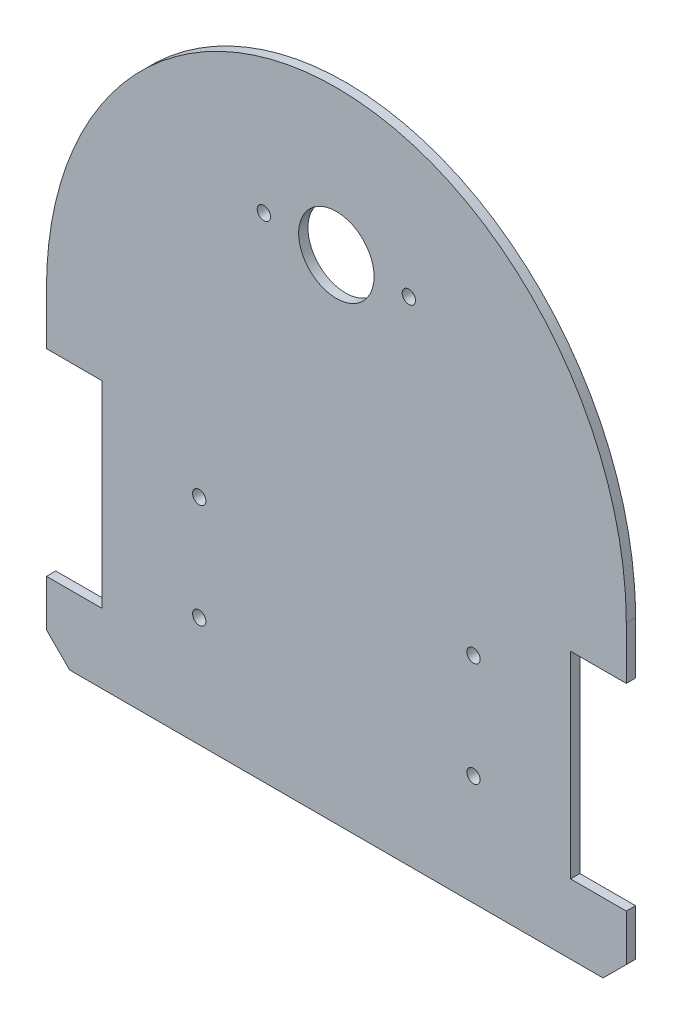
ISO-10303-21;
HEADER;
FILE_DESCRIPTION(('STEP AP214'),'2;1');
FILE_NAME('part.step','',(''),(''),'','','');
FILE_SCHEMA(('AUTOMOTIVE_DESIGN { 1 0 10303 214 1 1 1 1 }'));
ENDSEC;
DATA;
#1=APPLICATION_CONTEXT('core data for automotive mechanical design processes');
#2=APPLICATION_PROTOCOL_DEFINITION('international standard','automotive_design',2000,#1);
#3=PRODUCT_CONTEXT('',#1,'mechanical');
#4=PRODUCT('Part','Part','',(#3));
#5=PRODUCT_RELATED_PRODUCT_CATEGORY('part','',(#4));
#6=PRODUCT_DEFINITION_FORMATION('','',#4);
#7=PRODUCT_DEFINITION_CONTEXT('part definition',#1,'design');
#8=PRODUCT_DEFINITION('design','',#6,#7);
#9=PRODUCT_DEFINITION_SHAPE('','',#8);
#10=(LENGTH_UNIT() NAMED_UNIT(*) SI_UNIT(.MILLI.,.METRE.));
#11=(NAMED_UNIT(*) PLANE_ANGLE_UNIT() SI_UNIT($,.RADIAN.));
#12=(NAMED_UNIT(*) SI_UNIT($,.STERADIAN.) SOLID_ANGLE_UNIT());
#13=UNCERTAINTY_MEASURE_WITH_UNIT(LENGTH_MEASURE(1.E-05),#10,'distance_accuracy_value','');
#14=(GEOMETRIC_REPRESENTATION_CONTEXT(3) GLOBAL_UNCERTAINTY_ASSIGNED_CONTEXT((#13)) GLOBAL_UNIT_ASSIGNED_CONTEXT((#10,
#11,#12)) REPRESENTATION_CONTEXT('',''));
#15=CARTESIAN_POINT('',(0.,0.,0.));
#16=DIRECTION('',(0.,0.,1.));
#17=DIRECTION('',(1.,0.,0.));
#18=AXIS2_PLACEMENT_3D('',#15,#16,#17);
#19=CARTESIAN_POINT('',(-50.,-55.,1.6));
#20=DIRECTION('',(1.,0.,0.));
#21=DIRECTION('',(0.,0.,-1.));
#22=AXIS2_PLACEMENT_3D('',#19,#20,#21);
#23=PLANE('',#22);
#24=DIRECTION('',(0.,-1.,0.));
#25=VECTOR('',#24,1.);
#26=CARTESIAN_POINT('',(-50.,-55.,0.));
#27=LINE('',#26,#25);
#28=CARTESIAN_POINT('',(-50.,0.,0.));
#29=VERTEX_POINT('',#28);
#30=CARTESIAN_POINT('',(-50.,-9.00000000000001,0.));
#31=VERTEX_POINT('',#30);
#32=EDGE_CURVE('E270',#29,#31,#27,.T.);
#33=ORIENTED_EDGE('',*,*,#32,.T.);
#34=DIRECTION('',(0.,0.,1.));
#35=VECTOR('',#34,1.);
#36=CARTESIAN_POINT('',(-50.,-9.00000000000001,0.));
#37=LINE('',#36,#35);
#38=CARTESIAN_POINT('',(-50.,-9.00000000000001,1.6));
#39=VERTEX_POINT('',#38);
#40=EDGE_CURVE('E186',#31,#39,#37,.T.);
#41=ORIENTED_EDGE('',*,*,#40,.T.);
#42=DIRECTION('',(0.,-1.,0.));
#43=VECTOR('',#42,1.);
#44=CARTESIAN_POINT('',(-50.,-55.,1.6));
#45=LINE('',#44,#43);
#46=CARTESIAN_POINT('',(-50.,0.,1.6));
#47=VERTEX_POINT('',#46);
#48=EDGE_CURVE('E313',#47,#39,#45,.T.);
#49=ORIENTED_EDGE('',*,*,#48,.F.);
#50=DIRECTION('',(0.,0.,1.));
#51=VECTOR('',#50,1.);
#52=CARTESIAN_POINT('',(-50.,0.,0.));
#53=LINE('',#52,#51);
#54=EDGE_CURVE('E273',#29,#47,#53,.T.);
#55=ORIENTED_EDGE('',*,*,#54,.F.);
#56=EDGE_LOOP('',(#33,#41,#49,#55));
#57=FACE_BOUND('',#56,.T.);
#58=ADVANCED_FACE('F45',(#57),#23,.F.);
#59=CARTESIAN_POINT('',(50.,-55.,1.6));
#60=DIRECTION('',(-1.,0.,0.));
#61=DIRECTION('',(0.,0.,1.));
#62=AXIS2_PLACEMENT_3D('',#59,#60,#61);
#63=PLANE('',#62);
#64=DIRECTION('',(0.,1.,0.));
#65=VECTOR('',#64,1.);
#66=CARTESIAN_POINT('',(50.,-55.,1.6));
#67=LINE('',#66,#65);
#68=CARTESIAN_POINT('',(50.,-51.,1.6));
#69=VERTEX_POINT('',#68);
#70=CARTESIAN_POINT('',(50.,-43.,1.6));
#71=VERTEX_POINT('',#70);
#72=EDGE_CURVE('E281',#69,#71,#67,.T.);
#73=ORIENTED_EDGE('',*,*,#72,.F.);
#74=DIRECTION('',(0.,0.,-1.));
#75=VECTOR('',#74,1.);
#76=CARTESIAN_POINT('',(50.,-51.,1.6));
#77=LINE('',#76,#75);
#78=CARTESIAN_POINT('',(50.,-51.,0.));
#79=VERTEX_POINT('',#78);
#80=EDGE_CURVE('E289',#69,#79,#77,.T.);
#81=ORIENTED_EDGE('',*,*,#80,.T.);
#82=DIRECTION('',(0.,1.,0.));
#83=VECTOR('',#82,1.);
#84=CARTESIAN_POINT('',(50.,-55.,0.));
#85=LINE('',#84,#83);
#86=CARTESIAN_POINT('',(50.,-43.,0.));
#87=VERTEX_POINT('',#86);
#88=EDGE_CURVE('E284',#79,#87,#85,.T.);
#89=ORIENTED_EDGE('',*,*,#88,.T.);
#90=DIRECTION('',(0.,0.,1.));
#91=VECTOR('',#90,1.);
#92=CARTESIAN_POINT('',(50.,-43.,0.));
#93=LINE('',#92,#91);
#94=EDGE_CURVE('E199',#87,#71,#93,.T.);
#95=ORIENTED_EDGE('',*,*,#94,.T.);
#96=EDGE_LOOP('',(#73,#81,#89,#95));
#97=FACE_BOUND('',#96,.T.);
#98=ADVANCED_FACE('F234',(#97),#63,.F.);
#99=CARTESIAN_POINT('',(0.,0.,1.6));
#100=DIRECTION('',(0.,0.,1.));
#101=DIRECTION('',(1.,0.,0.));
#102=AXIS2_PLACEMENT_3D('',#99,#100,#101);
#103=PLANE('',#102);
#104=CARTESIAN_POINT('',(-12.5,30.,1.6));
#105=DIRECTION('',(0.,0.,1.));
#106=DIRECTION('',(1.,0.,0.));
#107=AXIS2_PLACEMENT_3D('',#104,#105,#106);
#108=CIRCLE('',#107,1.15);
#109=CARTESIAN_POINT('',(-11.35,30.,1.6));
#110=VERTEX_POINT('',#109);
#111=EDGE_CURVE('E568',#110,#110,#108,.T.);
#112=ORIENTED_EDGE('',*,*,#111,.F.);
#113=EDGE_LOOP('',(#112));
#114=FACE_BOUND('',#113,.T.);
#115=CARTESIAN_POINT('',(12.5,30.,1.6));
#116=DIRECTION('',(0.,0.,1.));
#117=DIRECTION('',(1.,0.,0.));
#118=AXIS2_PLACEMENT_3D('',#115,#116,#117);
#119=CIRCLE('',#118,1.15);
#120=CARTESIAN_POINT('',(13.65,30.,1.6));
#121=VERTEX_POINT('',#120);
#122=EDGE_CURVE('E569',#121,#121,#119,.T.);
#123=ORIENTED_EDGE('',*,*,#122,.F.);
#124=EDGE_LOOP('',(#123));
#125=FACE_BOUND('',#124,.T.);
#126=CARTESIAN_POINT('',(23.6499875636657,-18.,1.6));
#127=DIRECTION('',(0.,0.,1.));
#128=DIRECTION('',(-1.,0.,0.));
#129=AXIS2_PLACEMENT_3D('',#126,#127,#128);
#130=CIRCLE('',#129,1.15);
#131=CARTESIAN_POINT('',(22.4999875636657,-18.,1.6));
#132=VERTEX_POINT('',#131);
#133=EDGE_CURVE('E592',#132,#132,#130,.T.);
#134=ORIENTED_EDGE('',*,*,#133,.F.);
#135=EDGE_LOOP('',(#134));
#136=FACE_BOUND('',#135,.T.);
#137=CARTESIAN_POINT('',(23.6499875636657,-36.,1.6));
#138=DIRECTION('',(0.,0.,1.));
#139=DIRECTION('',(-1.,0.,0.));
#140=AXIS2_PLACEMENT_3D('',#137,#138,#139);
#141=CIRCLE('',#140,1.15);
#142=CARTESIAN_POINT('',(22.4999875636657,-36.,1.6));
#143=VERTEX_POINT('',#142);
#144=EDGE_CURVE('E586',#143,#143,#141,.T.);
#145=ORIENTED_EDGE('',*,*,#144,.F.);
#146=EDGE_LOOP('',(#145));
#147=FACE_BOUND('',#146,.T.);
#148=CARTESIAN_POINT('',(-23.6499875636657,-36.,1.6));
#149=DIRECTION('',(0.,0.,1.));
#150=DIRECTION('',(1.,0.,0.));
#151=AXIS2_PLACEMENT_3D('',#148,#149,#150);
#152=CIRCLE('',#151,1.15);
#153=CARTESIAN_POINT('',(-22.4999875636657,-36.,1.6));
#154=VERTEX_POINT('',#153);
#155=EDGE_CURVE('E579',#154,#154,#152,.T.);
#156=ORIENTED_EDGE('',*,*,#155,.F.);
#157=EDGE_LOOP('',(#156));
#158=FACE_BOUND('',#157,.T.);
#159=CARTESIAN_POINT('',(-23.6499875636657,-18.,1.6));
#160=DIRECTION('',(0.,0.,1.));
#161=DIRECTION('',(1.,0.,0.));
#162=AXIS2_PLACEMENT_3D('',#159,#160,#161);
#163=CIRCLE('',#162,1.15);
#164=CARTESIAN_POINT('',(-22.4999875636657,-18.,1.6));
#165=VERTEX_POINT('',#164);
#166=EDGE_CURVE('E582',#165,#165,#163,.T.);
#167=ORIENTED_EDGE('',*,*,#166,.F.);
#168=EDGE_LOOP('',(#167));
#169=FACE_BOUND('',#168,.T.);
#170=CARTESIAN_POINT('',(0.,30.,1.6));
#171=DIRECTION('',(0.,0.,1.));
#172=DIRECTION('',(1.,0.,0.));
#173=AXIS2_PLACEMENT_3D('',#170,#171,#172);
#174=CIRCLE('',#173,6.5);
#175=CARTESIAN_POINT('',(6.5,30.,1.6));
#176=VERTEX_POINT('',#175);
#177=EDGE_CURVE('E179',#176,#176,#174,.T.);
#178=ORIENTED_EDGE('',*,*,#177,.F.);
#179=EDGE_LOOP('',(#178));
#180=FACE_BOUND('',#179,.T.);
#181=DIRECTION('',(1.,0.,0.));
#182=VECTOR('',#181,1.);
#183=CARTESIAN_POINT('',(50.,-55.,1.6));
#184=LINE('',#183,#182);
#185=CARTESIAN_POINT('',(-46.,-55.,1.6));
#186=VERTEX_POINT('',#185);
#187=CARTESIAN_POINT('',(46.,-55.,1.6));
#188=VERTEX_POINT('',#187);
#189=EDGE_CURVE('E304',#186,#188,#184,.T.);
#190=ORIENTED_EDGE('',*,*,#189,.T.);
#191=DIRECTION('',(-0.707106781186549,-0.707106781186546,0.));
#192=VECTOR('',#191,1.);
#193=CARTESIAN_POINT('',(50.4999999999999,-50.5000000000001,1.6));
#194=LINE('',#193,#192);
#195=EDGE_CURVE('E54',#188,#69,#194,.F.);
#196=ORIENTED_EDGE('',*,*,#195,.T.);
#197=ORIENTED_EDGE('',*,*,#72,.T.);
#198=DIRECTION('',(1.,0.,0.));
#199=VECTOR('',#198,1.);
#200=CARTESIAN_POINT('',(50.,-43.,1.6));
#201=LINE('',#200,#199);
#202=CARTESIAN_POINT('',(40.4,-43.,1.6));
#203=VERTEX_POINT('',#202);
#204=EDGE_CURVE('E203',#203,#71,#201,.T.);
#205=ORIENTED_EDGE('',*,*,#204,.F.);
#206=DIRECTION('',(0.,-1.,0.));
#207=VECTOR('',#206,1.);
#208=CARTESIAN_POINT('',(40.4,-9.00000000000001,1.6));
#209=LINE('',#208,#207);
#210=CARTESIAN_POINT('',(40.4,-9.00000000000001,1.6));
#211=VERTEX_POINT('',#210);
#212=EDGE_CURVE('E206',#211,#203,#209,.T.);
#213=ORIENTED_EDGE('',*,*,#212,.F.);
#214=DIRECTION('',(-1.,0.,0.));
#215=VECTOR('',#214,1.);
#216=CARTESIAN_POINT('',(50.,-9.00000000000001,1.6));
#217=LINE('',#216,#215);
#218=CARTESIAN_POINT('',(50.,-9.00000000000001,1.6));
#219=VERTEX_POINT('',#218);
#220=EDGE_CURVE('E184',#219,#211,#217,.T.);
#221=ORIENTED_EDGE('',*,*,#220,.F.);
#222=CARTESIAN_POINT('',(50.,0.,1.6));
#223=VERTEX_POINT('',#222);
#224=EDGE_CURVE('E307',#219,#223,#67,.T.);
#225=ORIENTED_EDGE('',*,*,#224,.T.);
#226=CARTESIAN_POINT('',(0.,0.,1.6));
#227=DIRECTION('',(0.,0.,-1.));
#228=DIRECTION('',(0.,-1.,0.));
#229=AXIS2_PLACEMENT_3D('',#226,#227,#228);
#230=ELLIPSE('',#229,55.,50.);
#231=EDGE_CURVE('E189',#47,#223,#230,.T.);
#232=ORIENTED_EDGE('',*,*,#231,.F.);
#233=ORIENTED_EDGE('',*,*,#48,.T.);
#234=DIRECTION('',(-1.,0.,0.));
#235=VECTOR('',#234,1.);
#236=CARTESIAN_POINT('',(-50.,-9.00000000000001,1.6));
#237=LINE('',#236,#235);
#238=CARTESIAN_POINT('',(-40.4,-9.00000000000001,1.6));
#239=VERTEX_POINT('',#238);
#240=EDGE_CURVE('E174',#239,#39,#237,.T.);
#241=ORIENTED_EDGE('',*,*,#240,.F.);
#242=DIRECTION('',(0.,1.,0.));
#243=VECTOR('',#242,1.);
#244=CARTESIAN_POINT('',(-40.4,-9.00000000000001,1.6));
#245=LINE('',#244,#243);
#246=CARTESIAN_POINT('',(-40.4,-43.,1.6));
#247=VERTEX_POINT('',#246);
#248=EDGE_CURVE('E176',#247,#239,#245,.T.);
#249=ORIENTED_EDGE('',*,*,#248,.F.);
#250=DIRECTION('',(1.,0.,0.));
#251=VECTOR('',#250,1.);
#252=CARTESIAN_POINT('',(-50.,-43.,1.6));
#253=LINE('',#252,#251);
#254=CARTESIAN_POINT('',(-50.,-43.,1.6));
#255=VERTEX_POINT('',#254);
#256=EDGE_CURVE('E155',#255,#247,#253,.T.);
#257=ORIENTED_EDGE('',*,*,#256,.F.);
#258=CARTESIAN_POINT('',(-50.,-51.,1.6));
#259=VERTEX_POINT('',#258);
#260=EDGE_CURVE('E286',#255,#259,#45,.T.);
#261=ORIENTED_EDGE('',*,*,#260,.T.);
#262=DIRECTION('',(-0.707106781186546,0.707106781186549,0.));
#263=VECTOR('',#262,1.);
#264=CARTESIAN_POINT('',(-50.5000000000001,-50.4999999999999,1.6));
#265=LINE('',#264,#263);
#266=EDGE_CURVE('E300',#259,#186,#265,.F.);
#267=ORIENTED_EDGE('',*,*,#266,.T.);
#268=EDGE_LOOP('',(#190,#196,#197,#205,#213,#221,#225,#232,#233,#241,#249,#257,#261,#267));
#269=FACE_BOUND('',#268,.T.);
#270=ADVANCED_FACE('F231',(#114,#125,#136,#147,#158,#169,#180,#269),#103,.T.);
#271=CARTESIAN_POINT('',(0.,0.,0.));
#272=DIRECTION('',(0.,0.,1.));
#273=DIRECTION('',(1.,0.,0.));
#274=AXIS2_PLACEMENT_3D('',#271,#272,#273);
#275=PLANE('',#274);
#276=CARTESIAN_POINT('',(-12.5,30.,0.));
#277=DIRECTION('',(0.,0.,1.));
#278=DIRECTION('',(1.,0.,0.));
#279=AXIS2_PLACEMENT_3D('',#276,#277,#278);
#280=CIRCLE('',#279,1.15);
#281=CARTESIAN_POINT('',(-11.35,30.,0.));
#282=VERTEX_POINT('',#281);
#283=EDGE_CURVE('E565',#282,#282,#280,.T.);
#284=ORIENTED_EDGE('',*,*,#283,.T.);
#285=EDGE_LOOP('',(#284));
#286=FACE_BOUND('',#285,.T.);
#287=CARTESIAN_POINT('',(12.5,30.,0.));
#288=DIRECTION('',(0.,0.,1.));
#289=DIRECTION('',(1.,0.,0.));
#290=AXIS2_PLACEMENT_3D('',#287,#288,#289);
#291=CIRCLE('',#290,1.15);
#292=CARTESIAN_POINT('',(13.65,30.,0.));
#293=VERTEX_POINT('',#292);
#294=EDGE_CURVE('E574',#293,#293,#291,.T.);
#295=ORIENTED_EDGE('',*,*,#294,.T.);
#296=EDGE_LOOP('',(#295));
#297=FACE_BOUND('',#296,.T.);
#298=CARTESIAN_POINT('',(23.6499875636657,-18.,0.));
#299=DIRECTION('',(0.,0.,1.));
#300=DIRECTION('',(-1.,0.,0.));
#301=AXIS2_PLACEMENT_3D('',#298,#299,#300);
#302=CIRCLE('',#301,1.15);
#303=CARTESIAN_POINT('',(22.4999875636657,-18.,0.));
#304=VERTEX_POINT('',#303);
#305=EDGE_CURVE('E571',#304,#304,#302,.T.);
#306=ORIENTED_EDGE('',*,*,#305,.T.);
#307=EDGE_LOOP('',(#306));
#308=FACE_BOUND('',#307,.T.);
#309=CARTESIAN_POINT('',(23.6499875636657,-36.,0.));
#310=DIRECTION('',(0.,0.,1.));
#311=DIRECTION('',(-1.,0.,0.));
#312=AXIS2_PLACEMENT_3D('',#309,#310,#311);
#313=CIRCLE('',#312,1.15);
#314=CARTESIAN_POINT('',(22.4999875636657,-36.,0.));
#315=VERTEX_POINT('',#314);
#316=EDGE_CURVE('E589',#315,#315,#313,.T.);
#317=ORIENTED_EDGE('',*,*,#316,.T.);
#318=EDGE_LOOP('',(#317));
#319=FACE_BOUND('',#318,.T.);
#320=CARTESIAN_POINT('',(-23.6499875636657,-36.,0.));
#321=DIRECTION('',(0.,0.,1.));
#322=DIRECTION('',(1.,0.,0.));
#323=AXIS2_PLACEMENT_3D('',#320,#321,#322);
#324=CIRCLE('',#323,1.15);
#325=CARTESIAN_POINT('',(-22.4999875636657,-36.,0.));
#326=VERTEX_POINT('',#325);
#327=EDGE_CURVE('E583',#326,#326,#324,.T.);
#328=ORIENTED_EDGE('',*,*,#327,.T.);
#329=EDGE_LOOP('',(#328));
#330=FACE_BOUND('',#329,.T.);
#331=CARTESIAN_POINT('',(-23.6499875636657,-18.,0.));
#332=DIRECTION('',(0.,0.,1.));
#333=DIRECTION('',(1.,0.,0.));
#334=AXIS2_PLACEMENT_3D('',#331,#332,#333);
#335=CIRCLE('',#334,1.15);
#336=CARTESIAN_POINT('',(-22.4999875636657,-18.,0.));
#337=VERTEX_POINT('',#336);
#338=EDGE_CURVE('E597',#337,#337,#335,.T.);
#339=ORIENTED_EDGE('',*,*,#338,.T.);
#340=EDGE_LOOP('',(#339));
#341=FACE_BOUND('',#340,.T.);
#342=CARTESIAN_POINT('',(0.,30.,0.));
#343=DIRECTION('',(0.,0.,1.));
#344=DIRECTION('',(1.,0.,0.));
#345=AXIS2_PLACEMENT_3D('',#342,#343,#344);
#346=CIRCLE('',#345,6.5);
#347=CARTESIAN_POINT('',(6.5,30.,0.));
#348=VERTEX_POINT('',#347);
#349=EDGE_CURVE('E202',#348,#348,#346,.T.);
#350=ORIENTED_EDGE('',*,*,#349,.T.);
#351=EDGE_LOOP('',(#350));
#352=FACE_BOUND('',#351,.T.);
#353=ORIENTED_EDGE('',*,*,#88,.F.);
#354=DIRECTION('',(0.707106781186549,0.707106781186546,0.));
#355=VECTOR('',#354,1.);
#356=CARTESIAN_POINT('',(50.,-51.,0.));
#357=LINE('',#356,#355);
#358=CARTESIAN_POINT('',(46.,-55.,0.));
#359=VERTEX_POINT('',#358);
#360=EDGE_CURVE('E294',#79,#359,#357,.F.);
#361=ORIENTED_EDGE('',*,*,#360,.T.);
#362=DIRECTION('',(1.,0.,0.));
#363=VECTOR('',#362,1.);
#364=CARTESIAN_POINT('',(50.,-55.,0.));
#365=LINE('',#364,#363);
#366=CARTESIAN_POINT('',(-46.,-55.,0.));
#367=VERTEX_POINT('',#366);
#368=EDGE_CURVE('E275',#367,#359,#365,.T.);
#369=ORIENTED_EDGE('',*,*,#368,.F.);
#370=DIRECTION('',(0.707106781186546,-0.707106781186549,0.));
#371=VECTOR('',#370,1.);
#372=CARTESIAN_POINT('',(-46.,-55.,0.));
#373=LINE('',#372,#371);
#374=CARTESIAN_POINT('',(-50.,-51.,0.));
#375=VERTEX_POINT('',#374);
#376=EDGE_CURVE('E292',#367,#375,#373,.F.);
#377=ORIENTED_EDGE('',*,*,#376,.T.);
#378=CARTESIAN_POINT('',(-50.,-43.,0.));
#379=VERTEX_POINT('',#378);
#380=EDGE_CURVE('E173',#379,#375,#27,.T.);
#381=ORIENTED_EDGE('',*,*,#380,.F.);
#382=DIRECTION('',(1.,0.,0.));
#383=VECTOR('',#382,1.);
#384=CARTESIAN_POINT('',(-50.,-43.,0.));
#385=LINE('',#384,#383);
#386=CARTESIAN_POINT('',(-40.4,-43.,0.));
#387=VERTEX_POINT('',#386);
#388=EDGE_CURVE('E152',#379,#387,#385,.T.);
#389=ORIENTED_EDGE('',*,*,#388,.T.);
#390=DIRECTION('',(0.,1.,0.));
#391=VECTOR('',#390,1.);
#392=CARTESIAN_POINT('',(-40.4,-9.00000000000001,0.));
#393=LINE('',#392,#391);
#394=CARTESIAN_POINT('',(-40.4,-9.00000000000001,0.));
#395=VERTEX_POINT('',#394);
#396=EDGE_CURVE('E163',#387,#395,#393,.T.);
#397=ORIENTED_EDGE('',*,*,#396,.T.);
#398=DIRECTION('',(-1.,0.,0.));
#399=VECTOR('',#398,1.);
#400=CARTESIAN_POINT('',(-50.,-9.00000000000001,0.));
#401=LINE('',#400,#399);
#402=EDGE_CURVE('E168',#395,#31,#401,.T.);
#403=ORIENTED_EDGE('',*,*,#402,.T.);
#404=ORIENTED_EDGE('',*,*,#32,.F.);
#405=CARTESIAN_POINT('',(0.,0.,0.));
#406=DIRECTION('',(0.,0.,-1.));
#407=DIRECTION('',(0.,-1.,0.));
#408=AXIS2_PLACEMENT_3D('',#405,#406,#407);
#409=ELLIPSE('',#408,55.,50.);
#410=CARTESIAN_POINT('',(50.,0.,0.));
#411=VERTEX_POINT('',#410);
#412=EDGE_CURVE('E287',#29,#411,#409,.T.);
#413=ORIENTED_EDGE('',*,*,#412,.T.);
#414=CARTESIAN_POINT('',(50.,-9.00000000000001,0.));
#415=VERTEX_POINT('',#414);
#416=EDGE_CURVE('E277',#415,#411,#85,.T.);
#417=ORIENTED_EDGE('',*,*,#416,.F.);
#418=DIRECTION('',(-1.,0.,0.));
#419=VECTOR('',#418,1.);
#420=CARTESIAN_POINT('',(50.,-9.00000000000001,0.));
#421=LINE('',#420,#419);
#422=CARTESIAN_POINT('',(40.4,-9.00000000000001,0.));
#423=VERTEX_POINT('',#422);
#424=EDGE_CURVE('E207',#415,#423,#421,.T.);
#425=ORIENTED_EDGE('',*,*,#424,.T.);
#426=DIRECTION('',(0.,-1.,0.));
#427=VECTOR('',#426,1.);
#428=CARTESIAN_POINT('',(40.4,-9.00000000000001,0.));
#429=LINE('',#428,#427);
#430=CARTESIAN_POINT('',(40.4,-43.,0.));
#431=VERTEX_POINT('',#430);
#432=EDGE_CURVE('E214',#423,#431,#429,.T.);
#433=ORIENTED_EDGE('',*,*,#432,.T.);
#434=DIRECTION('',(1.,0.,0.));
#435=VECTOR('',#434,1.);
#436=CARTESIAN_POINT('',(50.,-43.,0.));
#437=LINE('',#436,#435);
#438=EDGE_CURVE('E194',#431,#87,#437,.T.);
#439=ORIENTED_EDGE('',*,*,#438,.T.);
#440=EDGE_LOOP('',(#353,#361,#369,#377,#381,#389,#397,#403,#404,#413,#417,#425,#433,#439));
#441=FACE_BOUND('',#440,.T.);
#442=ADVANCED_FACE('F172',(#286,#297,#308,#319,#330,#341,#352,#441),#275,.F.);
#443=ORIENTED_EDGE('',*,*,#380,.T.);
#444=DIRECTION('',(0.,0.,1.));
#445=VECTOR('',#444,1.);
#446=CARTESIAN_POINT('',(-50.,-51.,1.6));
#447=LINE('',#446,#445);
#448=EDGE_CURVE('E11',#375,#259,#447,.T.);
#449=ORIENTED_EDGE('',*,*,#448,.T.);
#450=ORIENTED_EDGE('',*,*,#260,.F.);
#451=DIRECTION('',(0.,0.,1.));
#452=VECTOR('',#451,1.);
#453=CARTESIAN_POINT('',(-50.,-43.,0.));
#454=LINE('',#453,#452);
#455=EDGE_CURVE('E160',#379,#255,#454,.T.);
#456=ORIENTED_EDGE('',*,*,#455,.F.);
#457=EDGE_LOOP('',(#443,#449,#450,#456));
#458=FACE_BOUND('',#457,.T.);
#459=ADVANCED_FACE('F238',(#458),#23,.F.);
#460=CARTESIAN_POINT('',(50.,-55.,1.6));
#461=DIRECTION('',(0.,1.,0.));
#462=DIRECTION('',(-1.,0.,0.));
#463=AXIS2_PLACEMENT_3D('',#460,#461,#462);
#464=PLANE('',#463);
#465=ORIENTED_EDGE('',*,*,#368,.T.);
#466=DIRECTION('',(0.,0.,1.));
#467=VECTOR('',#466,1.);
#468=CARTESIAN_POINT('',(46.,-55.,1.6));
#469=LINE('',#468,#467);
#470=EDGE_CURVE('E67',#359,#188,#469,.T.);
#471=ORIENTED_EDGE('',*,*,#470,.T.);
#472=ORIENTED_EDGE('',*,*,#189,.F.);
#473=DIRECTION('',(0.,0.,-1.));
#474=VECTOR('',#473,1.);
#475=CARTESIAN_POINT('',(-46.,-55.,1.6));
#476=LINE('',#475,#474);
#477=EDGE_CURVE('E296',#186,#367,#476,.T.);
#478=ORIENTED_EDGE('',*,*,#477,.T.);
#479=EDGE_LOOP('',(#465,#471,#472,#478));
#480=FACE_BOUND('',#479,.T.);
#481=ADVANCED_FACE('F242',(#480),#464,.F.);
#482=ORIENTED_EDGE('',*,*,#224,.F.);
#483=DIRECTION('',(0.,0.,1.));
#484=VECTOR('',#483,1.);
#485=CARTESIAN_POINT('',(50.,-9.00000000000001,0.));
#486=LINE('',#485,#484);
#487=EDGE_CURVE('E192',#415,#219,#486,.T.);
#488=ORIENTED_EDGE('',*,*,#487,.F.);
#489=ORIENTED_EDGE('',*,*,#416,.T.);
#490=DIRECTION('',(0.,0.,1.));
#491=VECTOR('',#490,1.);
#492=CARTESIAN_POINT('',(50.,0.,0.));
#493=LINE('',#492,#491);
#494=EDGE_CURVE('E279',#411,#223,#493,.T.);
#495=ORIENTED_EDGE('',*,*,#494,.T.);
#496=EDGE_LOOP('',(#482,#488,#489,#495));
#497=FACE_BOUND('',#496,.T.);
#498=ADVANCED_FACE('F228',(#497),#63,.F.);
#499=CARTESIAN_POINT('',(0.,0.,0.));
#500=DIRECTION('',(0.,0.,-1.));
#501=DIRECTION('',(0.,-1.,0.));
#502=AXIS2_PLACEMENT_3D('',#499,#500,#501);
#503=ELLIPSE('',#502,55.,50.);
#504=DIRECTION('',(0.,0.,1.));
#505=VECTOR('',#504,1.);
#506=SURFACE_OF_LINEAR_EXTRUSION('',#503,#505);
#507=ORIENTED_EDGE('',*,*,#412,.F.);
#508=ORIENTED_EDGE('',*,*,#54,.T.);
#509=ORIENTED_EDGE('',*,*,#231,.T.);
#510=ORIENTED_EDGE('',*,*,#494,.F.);
#511=EDGE_LOOP('',(#507,#508,#509,#510));
#512=FACE_BOUND('',#511,.T.);
#513=ADVANCED_FACE('F223',(#512),#506,.F.);
#514=CARTESIAN_POINT('',(50.,-43.,0.));
#515=DIRECTION('',(0.,-1.,0.));
#516=DIRECTION('',(1.,0.,0.));
#517=AXIS2_PLACEMENT_3D('',#514,#515,#516);
#518=PLANE('',#517);
#519=ORIENTED_EDGE('',*,*,#204,.T.);
#520=ORIENTED_EDGE('',*,*,#94,.F.);
#521=ORIENTED_EDGE('',*,*,#438,.F.);
#522=DIRECTION('',(0.,0.,1.));
#523=VECTOR('',#522,1.);
#524=CARTESIAN_POINT('',(40.4,-43.,0.));
#525=LINE('',#524,#523);
#526=EDGE_CURVE('E197',#431,#203,#525,.T.);
#527=ORIENTED_EDGE('',*,*,#526,.T.);
#528=EDGE_LOOP('',(#519,#520,#521,#527));
#529=FACE_BOUND('',#528,.T.);
#530=ADVANCED_FACE('F227',(#529),#518,.F.);
#531=CARTESIAN_POINT('',(40.4,-9.00000000000001,0.));
#532=DIRECTION('',(-1.,0.,0.));
#533=DIRECTION('',(0.,-1.,0.));
#534=AXIS2_PLACEMENT_3D('',#531,#532,#533);
#535=PLANE('',#534);
#536=ORIENTED_EDGE('',*,*,#212,.T.);
#537=ORIENTED_EDGE('',*,*,#526,.F.);
#538=ORIENTED_EDGE('',*,*,#432,.F.);
#539=DIRECTION('',(0.,0.,1.));
#540=VECTOR('',#539,1.);
#541=CARTESIAN_POINT('',(40.4,-9.00000000000001,0.));
#542=LINE('',#541,#540);
#543=EDGE_CURVE('E195',#423,#211,#542,.T.);
#544=ORIENTED_EDGE('',*,*,#543,.T.);
#545=EDGE_LOOP('',(#536,#537,#538,#544));
#546=FACE_BOUND('',#545,.T.);
#547=ADVANCED_FACE('F324',(#546),#535,.F.);
#548=CARTESIAN_POINT('',(50.,-9.00000000000001,0.));
#549=DIRECTION('',(0.,1.,0.));
#550=DIRECTION('',(0.,0.,1.));
#551=AXIS2_PLACEMENT_3D('',#548,#549,#550);
#552=PLANE('',#551);
#553=ORIENTED_EDGE('',*,*,#220,.T.);
#554=ORIENTED_EDGE('',*,*,#543,.F.);
#555=ORIENTED_EDGE('',*,*,#424,.F.);
#556=ORIENTED_EDGE('',*,*,#487,.T.);
#557=EDGE_LOOP('',(#553,#554,#555,#556));
#558=FACE_BOUND('',#557,.T.);
#559=ADVANCED_FACE('F317',(#558),#552,.F.);
#560=CARTESIAN_POINT('',(-50.,-9.00000000000001,0.));
#561=DIRECTION('',(0.,1.,0.));
#562=DIRECTION('',(0.,0.,1.));
#563=AXIS2_PLACEMENT_3D('',#560,#561,#562);
#564=PLANE('',#563);
#565=ORIENTED_EDGE('',*,*,#240,.T.);
#566=ORIENTED_EDGE('',*,*,#40,.F.);
#567=ORIENTED_EDGE('',*,*,#402,.F.);
#568=DIRECTION('',(0.,0.,1.));
#569=VECTOR('',#568,1.);
#570=CARTESIAN_POINT('',(-40.4,-9.00000000000001,0.));
#571=LINE('',#570,#569);
#572=EDGE_CURVE('E159',#395,#239,#571,.T.);
#573=ORIENTED_EDGE('',*,*,#572,.T.);
#574=EDGE_LOOP('',(#565,#566,#567,#573));
#575=FACE_BOUND('',#574,.T.);
#576=ADVANCED_FACE('F315',(#575),#564,.F.);
#577=CARTESIAN_POINT('',(-40.4,-9.00000000000001,0.));
#578=DIRECTION('',(1.,0.,0.));
#579=DIRECTION('',(0.,1.,0.));
#580=AXIS2_PLACEMENT_3D('',#577,#578,#579);
#581=PLANE('',#580);
#582=ORIENTED_EDGE('',*,*,#248,.T.);
#583=ORIENTED_EDGE('',*,*,#572,.F.);
#584=ORIENTED_EDGE('',*,*,#396,.F.);
#585=DIRECTION('',(0.,0.,1.));
#586=VECTOR('',#585,1.);
#587=CARTESIAN_POINT('',(-40.4,-43.,0.));
#588=LINE('',#587,#586);
#589=EDGE_CURVE('E148',#387,#247,#588,.T.);
#590=ORIENTED_EDGE('',*,*,#589,.T.);
#591=EDGE_LOOP('',(#582,#583,#584,#590));
#592=FACE_BOUND('',#591,.T.);
#593=ADVANCED_FACE('F164',(#592),#581,.F.);
#594=CARTESIAN_POINT('',(-50.,-43.,0.));
#595=DIRECTION('',(0.,-1.,0.));
#596=DIRECTION('',(1.,0.,0.));
#597=AXIS2_PLACEMENT_3D('',#594,#595,#596);
#598=PLANE('',#597);
#599=ORIENTED_EDGE('',*,*,#256,.T.);
#600=ORIENTED_EDGE('',*,*,#589,.F.);
#601=ORIENTED_EDGE('',*,*,#388,.F.);
#602=ORIENTED_EDGE('',*,*,#455,.T.);
#603=EDGE_LOOP('',(#599,#600,#601,#602));
#604=FACE_BOUND('',#603,.T.);
#605=ADVANCED_FACE('F150',(#604),#598,.F.);
#606=CARTESIAN_POINT('',(50.,-51.,1.6));
#607=DIRECTION('',(-0.707106781186546,0.707106781186549,0.));
#608=DIRECTION('',(0.,0.,-1.));
#609=AXIS2_PLACEMENT_3D('',#606,#607,#608);
#610=PLANE('',#609);
#611=ORIENTED_EDGE('',*,*,#195,.F.);
#612=ORIENTED_EDGE('',*,*,#470,.F.);
#613=ORIENTED_EDGE('',*,*,#360,.F.);
#614=ORIENTED_EDGE('',*,*,#80,.F.);
#615=EDGE_LOOP('',(#611,#612,#613,#614));
#616=FACE_BOUND('',#615,.T.);
#617=ADVANCED_FACE('F248',(#616),#610,.F.);
#618=CARTESIAN_POINT('',(-46.,-55.,1.6));
#619=DIRECTION('',(0.707106781186549,0.707106781186546,0.));
#620=DIRECTION('',(0.,0.,-1.));
#621=AXIS2_PLACEMENT_3D('',#618,#619,#620);
#622=PLANE('',#621);
#623=ORIENTED_EDGE('',*,*,#266,.F.);
#624=ORIENTED_EDGE('',*,*,#448,.F.);
#625=ORIENTED_EDGE('',*,*,#376,.F.);
#626=ORIENTED_EDGE('',*,*,#477,.F.);
#627=EDGE_LOOP('',(#623,#624,#625,#626));
#628=FACE_BOUND('',#627,.T.);
#629=ADVANCED_FACE('F48',(#628),#622,.F.);
#630=CARTESIAN_POINT('',(0.,30.,0.));
#631=DIRECTION('',(0.,0.,1.));
#632=DIRECTION('',(1.,0.,0.));
#633=AXIS2_PLACEMENT_3D('',#630,#631,#632);
#634=CYLINDRICAL_SURFACE('',#633,6.5);
#635=ORIENTED_EDGE('',*,*,#349,.F.);
#636=EDGE_LOOP('',(#635));
#637=FACE_BOUND('',#636,.T.);
#638=ORIENTED_EDGE('',*,*,#177,.T.);
#639=EDGE_LOOP('',(#638));
#640=FACE_BOUND('',#639,.T.);
#641=ADVANCED_FACE('F257',(#637,#640),#634,.F.);
#642=CARTESIAN_POINT('',(-23.6499875636657,-18.,0.));
#643=DIRECTION('',(0.,0.,1.));
#644=DIRECTION('',(1.,0.,0.));
#645=AXIS2_PLACEMENT_3D('',#642,#643,#644);
#646=CYLINDRICAL_SURFACE('',#645,1.15);
#647=ORIENTED_EDGE('',*,*,#338,.F.);
#648=EDGE_LOOP('',(#647));
#649=FACE_BOUND('',#648,.T.);
#650=ORIENTED_EDGE('',*,*,#166,.T.);
#651=EDGE_LOOP('',(#650));
#652=FACE_BOUND('',#651,.T.);
#653=ADVANCED_FACE('F460',(#649,#652),#646,.F.);
#654=CARTESIAN_POINT('',(-23.6499875636657,-36.,0.));
#655=DIRECTION('',(0.,0.,1.));
#656=DIRECTION('',(1.,0.,0.));
#657=AXIS2_PLACEMENT_3D('',#654,#655,#656);
#658=CYLINDRICAL_SURFACE('',#657,1.15);
#659=ORIENTED_EDGE('',*,*,#327,.F.);
#660=EDGE_LOOP('',(#659));
#661=FACE_BOUND('',#660,.T.);
#662=ORIENTED_EDGE('',*,*,#155,.T.);
#663=EDGE_LOOP('',(#662));
#664=FACE_BOUND('',#663,.T.);
#665=ADVANCED_FACE('F469',(#661,#664),#658,.F.);
#666=CARTESIAN_POINT('',(23.6499875636657,-36.,0.));
#667=DIRECTION('',(0.,0.,1.));
#668=DIRECTION('',(1.,0.,0.));
#669=AXIS2_PLACEMENT_3D('',#666,#667,#668);
#670=CYLINDRICAL_SURFACE('',#669,1.15);
#671=ORIENTED_EDGE('',*,*,#316,.F.);
#672=EDGE_LOOP('',(#671));
#673=FACE_BOUND('',#672,.T.);
#674=ORIENTED_EDGE('',*,*,#144,.T.);
#675=EDGE_LOOP('',(#674));
#676=FACE_BOUND('',#675,.T.);
#677=ADVANCED_FACE('F478',(#673,#676),#670,.F.);
#678=CARTESIAN_POINT('',(23.6499875636657,-18.,0.));
#679=DIRECTION('',(0.,0.,1.));
#680=DIRECTION('',(1.,0.,0.));
#681=AXIS2_PLACEMENT_3D('',#678,#679,#680);
#682=CYLINDRICAL_SURFACE('',#681,1.15);
#683=ORIENTED_EDGE('',*,*,#305,.F.);
#684=EDGE_LOOP('',(#683));
#685=FACE_BOUND('',#684,.T.);
#686=ORIENTED_EDGE('',*,*,#133,.T.);
#687=EDGE_LOOP('',(#686));
#688=FACE_BOUND('',#687,.T.);
#689=ADVANCED_FACE('F488',(#685,#688),#682,.F.);
#690=CARTESIAN_POINT('',(12.5,30.,0.));
#691=DIRECTION('',(0.,0.,1.));
#692=DIRECTION('',(1.,0.,0.));
#693=AXIS2_PLACEMENT_3D('',#690,#691,#692);
#694=CYLINDRICAL_SURFACE('',#693,1.15);
#695=ORIENTED_EDGE('',*,*,#294,.F.);
#696=EDGE_LOOP('',(#695));
#697=FACE_BOUND('',#696,.T.);
#698=ORIENTED_EDGE('',*,*,#122,.T.);
#699=EDGE_LOOP('',(#698));
#700=FACE_BOUND('',#699,.T.);
#701=ADVANCED_FACE('F497',(#697,#700),#694,.F.);
#702=CARTESIAN_POINT('',(-12.5,30.,0.));
#703=DIRECTION('',(0.,0.,1.));
#704=DIRECTION('',(1.,0.,0.));
#705=AXIS2_PLACEMENT_3D('',#702,#703,#704);
#706=CYLINDRICAL_SURFACE('',#705,1.15);
#707=ORIENTED_EDGE('',*,*,#283,.F.);
#708=EDGE_LOOP('',(#707));
#709=FACE_BOUND('',#708,.T.);
#710=ORIENTED_EDGE('',*,*,#111,.T.);
#711=EDGE_LOOP('',(#710));
#712=FACE_BOUND('',#711,.T.);
#713=ADVANCED_FACE('F506',(#709,#712),#706,.F.);
#714=CLOSED_SHELL('',(#58,#98,#270,#442,#459,#481,#498,#513,#530,#547,#559,#576,#593,#605,#617,
#629,#641,#653,#665,#677,#689,#701,#713));
#715=MANIFOLD_SOLID_BREP('B2',#714);
#716=ADVANCED_BREP_SHAPE_REPRESENTATION('',(#18,#715),#14);
#717=SHAPE_DEFINITION_REPRESENTATION(#9,#716);
ENDSEC;
END-ISO-10303-21;
